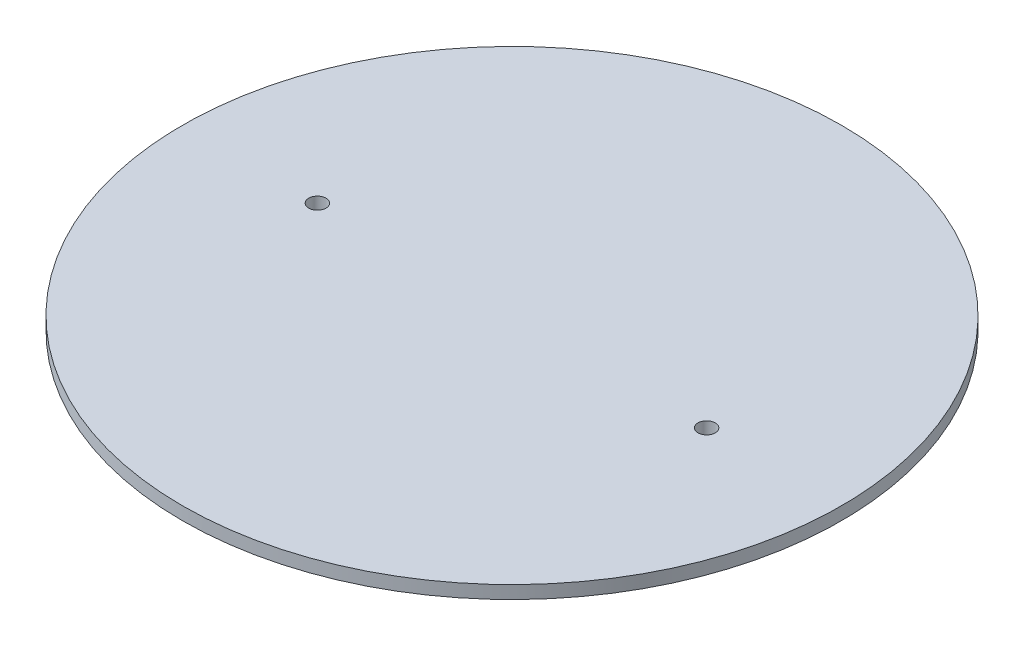
ISO-10303-21;
HEADER;
FILE_DESCRIPTION(('STEP AP214'),'2;1');
FILE_NAME('part.step','',(''),(''),'','','');
FILE_SCHEMA(('AUTOMOTIVE_DESIGN { 1 0 10303 214 1 1 1 1 }'));
ENDSEC;
DATA;
#1=APPLICATION_CONTEXT('core data for automotive mechanical design processes');
#2=APPLICATION_PROTOCOL_DEFINITION('international standard','automotive_design',2000,#1);
#3=PRODUCT_CONTEXT('',#1,'mechanical');
#4=PRODUCT('Part','Part','',(#3));
#5=PRODUCT_RELATED_PRODUCT_CATEGORY('part','',(#4));
#6=PRODUCT_DEFINITION_FORMATION('','',#4);
#7=PRODUCT_DEFINITION_CONTEXT('part definition',#1,'design');
#8=PRODUCT_DEFINITION('design','',#6,#7);
#9=PRODUCT_DEFINITION_SHAPE('','',#8);
#10=(LENGTH_UNIT() NAMED_UNIT(*) SI_UNIT(.MILLI.,.METRE.));
#11=(NAMED_UNIT(*) PLANE_ANGLE_UNIT() SI_UNIT($,.RADIAN.));
#12=(NAMED_UNIT(*) SI_UNIT($,.STERADIAN.) SOLID_ANGLE_UNIT());
#13=UNCERTAINTY_MEASURE_WITH_UNIT(LENGTH_MEASURE(1.E-05),#10,'distance_accuracy_value','');
#14=(GEOMETRIC_REPRESENTATION_CONTEXT(3) GLOBAL_UNCERTAINTY_ASSIGNED_CONTEXT((#13)) GLOBAL_UNIT_ASSIGNED_CONTEXT((#10,
#11,#12)) REPRESENTATION_CONTEXT('',''));
#15=CARTESIAN_POINT('',(0.,0.,0.));
#16=DIRECTION('',(0.,0.,1.));
#17=DIRECTION('',(1.,0.,0.));
#18=AXIS2_PLACEMENT_3D('',#15,#16,#17);
#19=CARTESIAN_POINT('',(0.,3.,0.));
#20=DIRECTION('',(0.,-1.,0.));
#21=DIRECTION('',(0.,0.,-1.));
#22=AXIS2_PLACEMENT_3D('',#19,#20,#21);
#23=CYLINDRICAL_SURFACE('',#22,76.2);
#24=CARTESIAN_POINT('',(0.,3.,0.));
#25=DIRECTION('',(0.,1.,0.));
#26=DIRECTION('',(0.,0.,1.));
#27=AXIS2_PLACEMENT_3D('',#24,#25,#26);
#28=CIRCLE('',#27,76.2);
#29=CARTESIAN_POINT('',(0.,3.,76.2));
#30=VERTEX_POINT('',#29);
#31=EDGE_CURVE('E10',#30,#30,#28,.T.);
#32=ORIENTED_EDGE('',*,*,#31,.F.);
#33=EDGE_LOOP('',(#32));
#34=FACE_BOUND('',#33,.T.);
#35=CARTESIAN_POINT('',(0.,0.,0.));
#36=DIRECTION('',(0.,1.,0.));
#37=DIRECTION('',(0.,0.,1.));
#38=AXIS2_PLACEMENT_3D('',#35,#36,#37);
#39=CIRCLE('',#38,76.2);
#40=CARTESIAN_POINT('',(0.,0.,76.2));
#41=VERTEX_POINT('',#40);
#42=EDGE_CURVE('E43',#41,#41,#39,.T.);
#43=ORIENTED_EDGE('',*,*,#42,.T.);
#44=EDGE_LOOP('',(#43));
#45=FACE_BOUND('',#44,.T.);
#46=ADVANCED_FACE('F36',(#34,#45),#23,.T.);
#47=CARTESIAN_POINT('',(0.,3.,0.));
#48=DIRECTION('',(0.,1.,0.));
#49=DIRECTION('',(0.,0.,1.));
#50=AXIS2_PLACEMENT_3D('',#47,#48,#49);
#51=PLANE('',#50);
#52=CARTESIAN_POINT('',(-45.,3.,0.));
#53=DIRECTION('',(0.,1.,0.));
#54=DIRECTION('',(0.,0.,1.));
#55=AXIS2_PLACEMENT_3D('',#52,#53,#54);
#56=CIRCLE('',#55,2.);
#57=CARTESIAN_POINT('',(-45.,3.,2.));
#58=VERTEX_POINT('',#57);
#59=EDGE_CURVE('E54',#58,#58,#56,.T.);
#60=ORIENTED_EDGE('',*,*,#59,.F.);
#61=EDGE_LOOP('',(#60));
#62=FACE_BOUND('',#61,.T.);
#63=CARTESIAN_POINT('',(45.,3.,0.));
#64=DIRECTION('',(0.,1.,0.));
#65=DIRECTION('',(0.,0.,1.));
#66=AXIS2_PLACEMENT_3D('',#63,#64,#65);
#67=CIRCLE('',#66,2.);
#68=CARTESIAN_POINT('',(45.,3.,2.));
#69=VERTEX_POINT('',#68);
#70=EDGE_CURVE('E50',#69,#69,#67,.T.);
#71=ORIENTED_EDGE('',*,*,#70,.F.);
#72=EDGE_LOOP('',(#71));
#73=FACE_BOUND('',#72,.T.);
#74=ORIENTED_EDGE('',*,*,#31,.T.);
#75=EDGE_LOOP('',(#74));
#76=FACE_BOUND('',#75,.T.);
#77=ADVANCED_FACE('F67',(#62,#73,#76),#51,.T.);
#78=CARTESIAN_POINT('',(0.,0.,0.));
#79=DIRECTION('',(0.,1.,0.));
#80=DIRECTION('',(0.,0.,1.));
#81=AXIS2_PLACEMENT_3D('',#78,#79,#80);
#82=PLANE('',#81);
#83=CARTESIAN_POINT('',(-45.,0.,0.));
#84=DIRECTION('',(0.,1.,0.));
#85=DIRECTION('',(0.,0.,1.));
#86=AXIS2_PLACEMENT_3D('',#83,#84,#85);
#87=CIRCLE('',#86,2.);
#88=CARTESIAN_POINT('',(-45.,0.,2.));
#89=VERTEX_POINT('',#88);
#90=EDGE_CURVE('E39',#89,#89,#87,.T.);
#91=ORIENTED_EDGE('',*,*,#90,.T.);
#92=EDGE_LOOP('',(#91));
#93=FACE_BOUND('',#92,.T.);
#94=CARTESIAN_POINT('',(45.,0.,0.));
#95=DIRECTION('',(0.,1.,0.));
#96=DIRECTION('',(0.,0.,1.));
#97=AXIS2_PLACEMENT_3D('',#94,#95,#96);
#98=CIRCLE('',#97,2.);
#99=CARTESIAN_POINT('',(45.,0.,2.));
#100=VERTEX_POINT('',#99);
#101=EDGE_CURVE('E52',#100,#100,#98,.T.);
#102=ORIENTED_EDGE('',*,*,#101,.T.);
#103=EDGE_LOOP('',(#102));
#104=FACE_BOUND('',#103,.T.);
#105=ORIENTED_EDGE('',*,*,#42,.F.);
#106=EDGE_LOOP('',(#105));
#107=FACE_BOUND('',#106,.T.);
#108=ADVANCED_FACE('F69',(#93,#104,#107),#82,.F.);
#109=CARTESIAN_POINT('',(45.,-7.,0.));
#110=DIRECTION('',(0.,1.,0.));
#111=DIRECTION('',(0.,0.,1.));
#112=AXIS2_PLACEMENT_3D('',#109,#110,#111);
#113=CYLINDRICAL_SURFACE('',#112,2.);
#114=ORIENTED_EDGE('',*,*,#70,.T.);
#115=EDGE_LOOP('',(#114));
#116=FACE_BOUND('',#115,.T.);
#117=ORIENTED_EDGE('',*,*,#101,.F.);
#118=EDGE_LOOP('',(#117));
#119=FACE_BOUND('',#118,.T.);
#120=ADVANCED_FACE('F64',(#116,#119),#113,.F.);
#121=CARTESIAN_POINT('',(-45.,-7.,0.));
#122=DIRECTION('',(0.,1.,0.));
#123=DIRECTION('',(0.,0.,1.));
#124=AXIS2_PLACEMENT_3D('',#121,#122,#123);
#125=CYLINDRICAL_SURFACE('',#124,2.);
#126=ORIENTED_EDGE('',*,*,#59,.T.);
#127=EDGE_LOOP('',(#126));
#128=FACE_BOUND('',#127,.T.);
#129=ORIENTED_EDGE('',*,*,#90,.F.);
#130=EDGE_LOOP('',(#129));
#131=FACE_BOUND('',#130,.T.);
#132=ADVANCED_FACE('F82',(#128,#131),#125,.F.);
#133=CLOSED_SHELL('',(#46,#77,#108,#120,#132));
#134=MANIFOLD_SOLID_BREP('B2',#133);
#135=ADVANCED_BREP_SHAPE_REPRESENTATION('',(#18,#134),#14);
#136=SHAPE_DEFINITION_REPRESENTATION(#9,#135);
ENDSEC;
END-ISO-10303-21;
